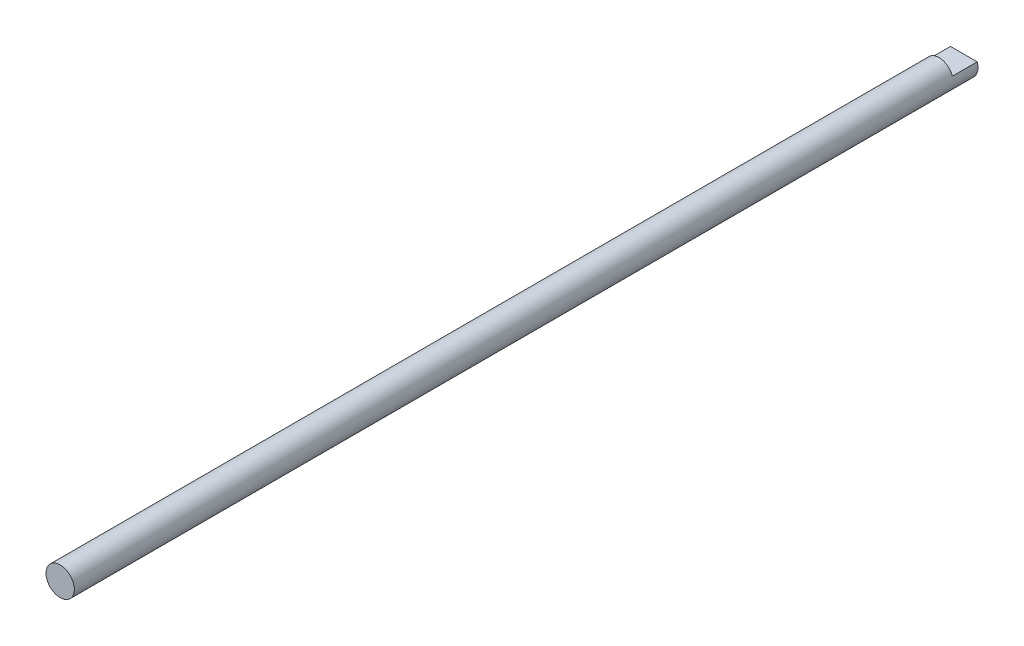
ISO-10303-21;
HEADER;
FILE_DESCRIPTION(('STEP AP214'),'2;1');
FILE_NAME('part.step','',(''),(''),'','','');
FILE_SCHEMA(('AUTOMOTIVE_DESIGN { 1 0 10303 214 1 1 1 1 }'));
ENDSEC;
DATA;
#1=APPLICATION_CONTEXT('core data for automotive mechanical design processes');
#2=APPLICATION_PROTOCOL_DEFINITION('international standard','automotive_design',2000,#1);
#3=PRODUCT_CONTEXT('',#1,'mechanical');
#4=PRODUCT('Part','Part','',(#3));
#5=PRODUCT_RELATED_PRODUCT_CATEGORY('part','',(#4));
#6=PRODUCT_DEFINITION_FORMATION('','',#4);
#7=PRODUCT_DEFINITION_CONTEXT('part definition',#1,'design');
#8=PRODUCT_DEFINITION('design','',#6,#7);
#9=PRODUCT_DEFINITION_SHAPE('','',#8);
#10=(LENGTH_UNIT() NAMED_UNIT(*) SI_UNIT(.MILLI.,.METRE.));
#11=(NAMED_UNIT(*) PLANE_ANGLE_UNIT() SI_UNIT($,.RADIAN.));
#12=(NAMED_UNIT(*) SI_UNIT($,.STERADIAN.) SOLID_ANGLE_UNIT());
#13=UNCERTAINTY_MEASURE_WITH_UNIT(LENGTH_MEASURE(1.E-05),#10,'distance_accuracy_value','');
#14=(GEOMETRIC_REPRESENTATION_CONTEXT(3) GLOBAL_UNCERTAINTY_ASSIGNED_CONTEXT((#13)) GLOBAL_UNIT_ASSIGNED_CONTEXT((#10,
#11,#12)) REPRESENTATION_CONTEXT('',''));
#15=CARTESIAN_POINT('',(0.,0.,0.));
#16=DIRECTION('',(0.,0.,1.));
#17=DIRECTION('',(1.,0.,0.));
#18=AXIS2_PLACEMENT_3D('',#15,#16,#17);
#19=CARTESIAN_POINT('',(0.,0.,255.));
#20=DIRECTION('',(0.,0.,-1.));
#21=DIRECTION('',(-1.,0.,0.));
#22=AXIS2_PLACEMENT_3D('',#19,#20,#21);
#23=CYLINDRICAL_SURFACE('',#22,4.);
#24=CARTESIAN_POINT('',(0.,0.,255.));
#25=DIRECTION('',(0.,0.,1.));
#26=DIRECTION('',(1.,0.,0.));
#27=AXIS2_PLACEMENT_3D('',#24,#25,#26);
#28=CIRCLE('',#27,4.);
#29=CARTESIAN_POINT('',(4.,0.,255.));
#30=VERTEX_POINT('',#29);
#31=EDGE_CURVE('E46',#30,#30,#28,.T.);
#32=ORIENTED_EDGE('',*,*,#31,.F.);
#33=EDGE_LOOP('',(#32));
#34=FACE_BOUND('',#33,.T.);
#35=DIRECTION('',(0.,0.,-1.));
#36=VECTOR('',#35,1.);
#37=CARTESIAN_POINT('',(-3.77123616632825,1.33333333333333,7.));
#38=LINE('',#37,#36);
#39=CARTESIAN_POINT('',(-3.77123616632825,1.33333333333333,7.));
#40=VERTEX_POINT('',#39);
#41=CARTESIAN_POINT('',(-3.77123616632825,1.33333333333333,0.));
#42=VERTEX_POINT('',#41);
#43=EDGE_CURVE('E66',#40,#42,#38,.T.);
#44=ORIENTED_EDGE('',*,*,#43,.T.);
#45=CARTESIAN_POINT('',(0.,0.,0.));
#46=DIRECTION('',(0.,0.,1.));
#47=DIRECTION('',(1.,0.,0.));
#48=AXIS2_PLACEMENT_3D('',#45,#46,#47);
#49=CIRCLE('',#48,4.);
#50=CARTESIAN_POINT('',(3.77123616632825,1.33333333333333,0.));
#51=VERTEX_POINT('',#50);
#52=EDGE_CURVE('E73',#42,#51,#49,.T.);
#53=ORIENTED_EDGE('',*,*,#52,.T.);
#54=DIRECTION('',(0.,0.,-1.));
#55=VECTOR('',#54,1.);
#56=CARTESIAN_POINT('',(3.77123616632825,1.33333333333333,7.));
#57=LINE('',#56,#55);
#58=CARTESIAN_POINT('',(3.77123616632825,1.33333333333333,7.));
#59=VERTEX_POINT('',#58);
#60=EDGE_CURVE('E53',#59,#51,#57,.T.);
#61=ORIENTED_EDGE('',*,*,#60,.F.);
#62=CARTESIAN_POINT('',(0.,0.,7.00000000000001));
#63=DIRECTION('',(0.,0.,-1.));
#64=DIRECTION('',(-1.,0.,0.));
#65=AXIS2_PLACEMENT_3D('',#62,#63,#64);
#66=CIRCLE('',#65,4.);
#67=EDGE_CURVE('E11',#40,#59,#66,.T.);
#68=ORIENTED_EDGE('',*,*,#67,.F.);
#69=EDGE_LOOP('',(#44,#53,#61,#68));
#70=FACE_BOUND('',#69,.T.);
#71=ADVANCED_FACE('F39',(#34,#70),#23,.T.);
#72=CARTESIAN_POINT('',(0.,0.,0.));
#73=DIRECTION('',(0.,0.,1.));
#74=DIRECTION('',(1.,0.,0.));
#75=AXIS2_PLACEMENT_3D('',#72,#73,#74);
#76=PLANE('',#75);
#77=DIRECTION('',(1.,0.,0.));
#78=VECTOR('',#77,1.);
#79=CARTESIAN_POINT('',(0.,1.33333333333333,0.));
#80=LINE('',#79,#78);
#81=EDGE_CURVE('E63',#42,#51,#80,.T.);
#82=ORIENTED_EDGE('',*,*,#81,.T.);
#83=ORIENTED_EDGE('',*,*,#52,.F.);
#84=EDGE_LOOP('',(#82,#83));
#85=FACE_BOUND('',#84,.T.);
#86=ADVANCED_FACE('F75',(#85),#76,.F.);
#87=CARTESIAN_POINT('',(0.,0.,255.));
#88=DIRECTION('',(0.,0.,1.));
#89=DIRECTION('',(1.,0.,0.));
#90=AXIS2_PLACEMENT_3D('',#87,#88,#89);
#91=PLANE('',#90);
#92=ORIENTED_EDGE('',*,*,#31,.T.);
#93=EDGE_LOOP('',(#92));
#94=FACE_BOUND('',#93,.T.);
#95=ADVANCED_FACE('F82',(#94),#91,.T.);
#96=CARTESIAN_POINT('',(0.,0.,7.));
#97=DIRECTION('',(0.,0.,-1.));
#98=DIRECTION('',(-1.,0.,0.));
#99=AXIS2_PLACEMENT_3D('',#96,#97,#98);
#100=PLANE('',#99);
#101=ORIENTED_EDGE('',*,*,#67,.T.);
#102=DIRECTION('',(1.,0.,0.));
#103=VECTOR('',#102,1.);
#104=CARTESIAN_POINT('',(0.,1.33333333333333,7.));
#105=LINE('',#104,#103);
#106=EDGE_CURVE('E70',#40,#59,#105,.T.);
#107=ORIENTED_EDGE('',*,*,#106,.F.);
#108=EDGE_LOOP('',(#101,#107));
#109=FACE_BOUND('',#108,.T.);
#110=ADVANCED_FACE('F80',(#109),#100,.T.);
#111=CARTESIAN_POINT('',(0.,1.33333333333333,7.));
#112=DIRECTION('',(0.,1.,0.));
#113=DIRECTION('',(0.,0.,1.));
#114=AXIS2_PLACEMENT_3D('',#111,#112,#113);
#115=PLANE('',#114);
#116=ORIENTED_EDGE('',*,*,#81,.F.);
#117=ORIENTED_EDGE('',*,*,#43,.F.);
#118=ORIENTED_EDGE('',*,*,#106,.T.);
#119=ORIENTED_EDGE('',*,*,#60,.T.);
#120=EDGE_LOOP('',(#116,#117,#118,#119));
#121=FACE_BOUND('',#120,.T.);
#122=ADVANCED_FACE('F65',(#121),#115,.T.);
#123=CLOSED_SHELL('',(#71,#86,#95,#110,#122));
#124=MANIFOLD_SOLID_BREP('B2',#123);
#125=ADVANCED_BREP_SHAPE_REPRESENTATION('',(#18,#124),#14);
#126=SHAPE_DEFINITION_REPRESENTATION(#9,#125);
ENDSEC;
END-ISO-10303-21;
